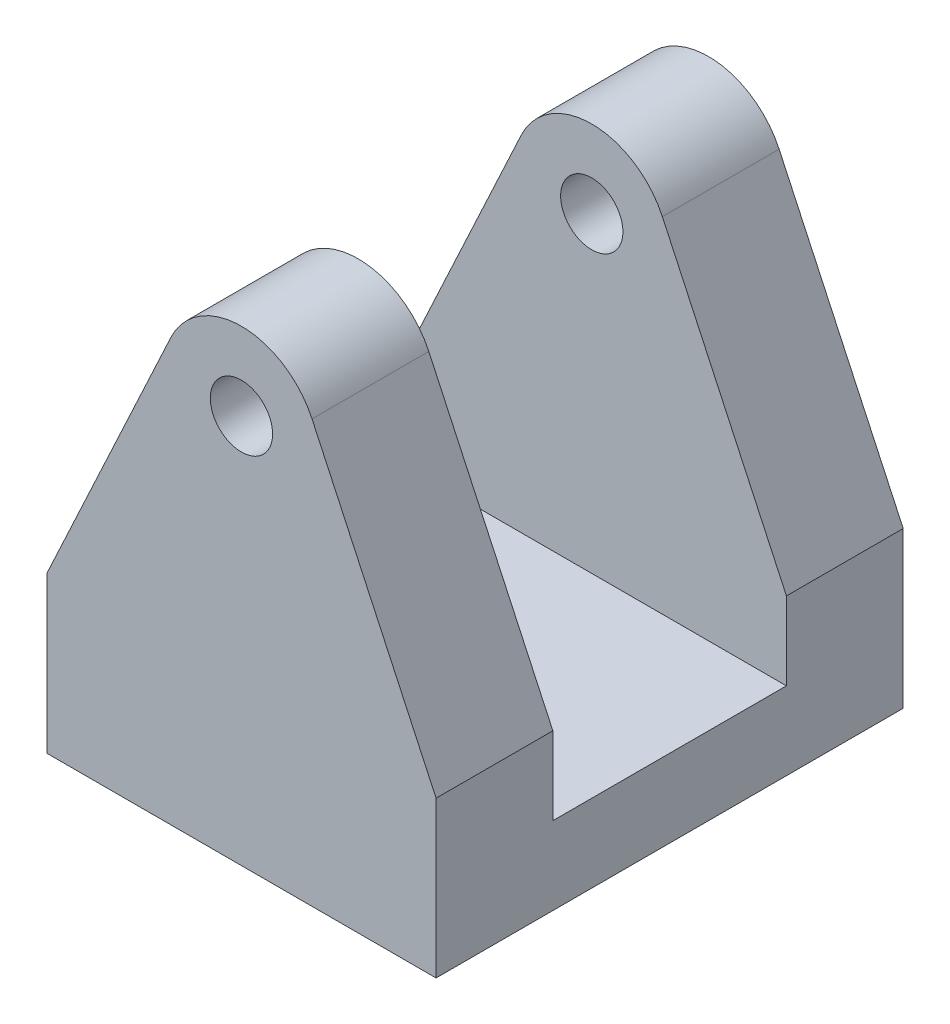
ISO-10303-21;
HEADER;
FILE_DESCRIPTION(('STEP AP214'),'2;1');
FILE_NAME('part.step','',(''),(''),'','','');
FILE_SCHEMA(('AUTOMOTIVE_DESIGN { 1 0 10303 214 1 1 1 1 }'));
ENDSEC;
DATA;
#1=APPLICATION_CONTEXT('core data for automotive mechanical design processes');
#2=APPLICATION_PROTOCOL_DEFINITION('international standard','automotive_design',2000,#1);
#3=PRODUCT_CONTEXT('',#1,'mechanical');
#4=PRODUCT('Part','Part','',(#3));
#5=PRODUCT_RELATED_PRODUCT_CATEGORY('part','',(#4));
#6=PRODUCT_DEFINITION_FORMATION('','',#4);
#7=PRODUCT_DEFINITION_CONTEXT('part definition',#1,'design');
#8=PRODUCT_DEFINITION('design','',#6,#7);
#9=PRODUCT_DEFINITION_SHAPE('','',#8);
#10=(LENGTH_UNIT() NAMED_UNIT(*) SI_UNIT(.MILLI.,.METRE.));
#11=(NAMED_UNIT(*) PLANE_ANGLE_UNIT() SI_UNIT($,.RADIAN.));
#12=(NAMED_UNIT(*) SI_UNIT($,.STERADIAN.) SOLID_ANGLE_UNIT());
#13=UNCERTAINTY_MEASURE_WITH_UNIT(LENGTH_MEASURE(1.E-05),#10,'distance_accuracy_value','');
#14=(GEOMETRIC_REPRESENTATION_CONTEXT(3) GLOBAL_UNCERTAINTY_ASSIGNED_CONTEXT((#13)) GLOBAL_UNIT_ASSIGNED_CONTEXT((#10,
#11,#12)) REPRESENTATION_CONTEXT('',''));
#15=CARTESIAN_POINT('',(0.,0.,0.));
#16=DIRECTION('',(0.,0.,1.));
#17=DIRECTION('',(1.,0.,0.));
#18=AXIS2_PLACEMENT_3D('',#15,#16,#17);
#19=CARTESIAN_POINT('',(34.2295020663656,53.4720968910606,0.));
#20=DIRECTION('',(0.,0.,1.));
#21=DIRECTION('',(1.,0.,0.));
#22=AXIS2_PLACEMENT_3D('',#19,#20,#21);
#23=PLANE('',#22);
#24=CARTESIAN_POINT('',(34.2295020663656,53.4720968910606,0.));
#25=DIRECTION('',(0.,0.,1.));
#26=DIRECTION('',(1.,0.,0.));
#27=AXIS2_PLACEMENT_3D('',#24,#25,#26);
#28=CIRCLE('',#27,5.08000000000001);
#29=CARTESIAN_POINT('',(39.3095020663656,53.4720968910606,0.));
#30=VERTEX_POINT('',#29);
#31=EDGE_CURVE('E123',#30,#30,#28,.F.);
#32=ORIENTED_EDGE('',*,*,#31,.F.);
#33=EDGE_LOOP('',(#32));
#34=FACE_BOUND('',#33,.T.);
#35=DIRECTION('',(1.,0.,0.));
#36=VECTOR('',#35,1.);
#37=CARTESIAN_POINT('',(65.9812170051089,2.66866701357397,0.));
#38=LINE('',#37,#36);
#39=CARTESIAN_POINT('',(2.47778712762231,2.66866701357397,0.));
#40=VERTEX_POINT('',#39);
#41=CARTESIAN_POINT('',(65.9812170051089,2.66866701357397,0.));
#42=VERTEX_POINT('',#41);
#43=EDGE_CURVE('E48',#40,#42,#38,.T.);
#44=ORIENTED_EDGE('',*,*,#43,.F.);
#45=DIRECTION('',(0.,-1.,0.));
#46=VECTOR('',#45,1.);
#47=CARTESIAN_POINT('',(2.47778712762231,-10.031332986426,0.));
#48=LINE('',#47,#46);
#49=CARTESIAN_POINT('',(2.47778712762231,15.3700389645686,0.));
#50=VERTEX_POINT('',#49);
#51=EDGE_CURVE('E127',#50,#40,#48,.T.);
#52=ORIENTED_EDGE('',*,*,#51,.F.);
#53=DIRECTION('',(-0.422117576661537,-0.906541091993844,0.));
#54=VECTOR('',#53,1.);
#55=CARTESIAN_POINT('',(2.47778712762231,15.3700389645686,0.));
#56=LINE('',#55,#54);
#57=CARTESIAN_POINT('',(22.7158083330674,58.8332796769767,0.));
#58=VERTEX_POINT('',#57);
#59=EDGE_CURVE('E79',#58,#50,#56,.T.);
#60=ORIENTED_EDGE('',*,*,#59,.F.);
#61=CARTESIAN_POINT('',(34.2295020663656,53.4720968910606,0.));
#62=DIRECTION('',(0.,0.,1.));
#63=DIRECTION('',(1.,0.,0.));
#64=AXIS2_PLACEMENT_3D('',#61,#62,#63);
#65=CIRCLE('',#64,12.7006859754973);
#66=CARTESIAN_POINT('',(45.7431957996639,58.8332796769767,0.));
#67=VERTEX_POINT('',#66);
#68=EDGE_CURVE('E110',#67,#58,#65,.T.);
#69=ORIENTED_EDGE('',*,*,#68,.F.);
#70=DIRECTION('',(-0.422117576661537,0.906541091993844,0.));
#71=VECTOR('',#70,1.);
#72=CARTESIAN_POINT('',(45.7431957996639,58.8332796769767,0.));
#73=LINE('',#72,#71);
#74=CARTESIAN_POINT('',(65.9812170051089,15.3700389645686,0.));
#75=VERTEX_POINT('',#74);
#76=EDGE_CURVE('E122',#75,#67,#73,.T.);
#77=ORIENTED_EDGE('',*,*,#76,.F.);
#78=DIRECTION('',(0.,1.,0.));
#79=VECTOR('',#78,1.);
#80=CARTESIAN_POINT('',(65.9812170051089,15.3700389645686,0.));
#81=LINE('',#80,#79);
#82=EDGE_CURVE('E120',#42,#75,#81,.T.);
#83=ORIENTED_EDGE('',*,*,#82,.F.);
#84=EDGE_LOOP('',(#44,#52,#60,#69,#77,#83));
#85=FACE_BOUND('',#84,.T.);
#86=ADVANCED_FACE('F33',(#34,#85),#23,.F.);
#87=CARTESIAN_POINT('',(65.9812170051089,-10.031332986426,19.05));
#88=DIRECTION('',(0.,1.,0.));
#89=DIRECTION('',(0.,0.,1.));
#90=AXIS2_PLACEMENT_3D('',#87,#88,#89);
#91=PLANE('',#90);
#92=DIRECTION('',(0.,0.,-1.));
#93=VECTOR('',#92,1.);
#94=CARTESIAN_POINT('',(2.47778712762231,-10.031332986426,19.05));
#95=LINE('',#94,#93);
#96=CARTESIAN_POINT('',(2.47778712762231,-10.031332986426,19.05));
#97=VERTEX_POINT('',#96);
#98=CARTESIAN_POINT('',(2.47778712762231,-10.031332986426,-57.15));
#99=VERTEX_POINT('',#98);
#100=EDGE_CURVE('E116',#97,#99,#95,.T.);
#101=ORIENTED_EDGE('',*,*,#100,.T.);
#102=DIRECTION('',(1.,0.,0.));
#103=VECTOR('',#102,1.);
#104=CARTESIAN_POINT('',(65.9812170051089,-10.031332986426,-57.15));
#105=LINE('',#104,#103);
#106=CARTESIAN_POINT('',(65.9812170051089,-10.031332986426,-57.15));
#107=VERTEX_POINT('',#106);
#108=EDGE_CURVE('E169',#99,#107,#105,.T.);
#109=ORIENTED_EDGE('',*,*,#108,.T.);
#110=DIRECTION('',(0.,0.,-1.));
#111=VECTOR('',#110,1.);
#112=CARTESIAN_POINT('',(65.9812170051089,-10.031332986426,19.05));
#113=LINE('',#112,#111);
#114=CARTESIAN_POINT('',(65.9812170051089,-10.031332986426,19.05));
#115=VERTEX_POINT('',#114);
#116=EDGE_CURVE('E11',#115,#107,#113,.T.);
#117=ORIENTED_EDGE('',*,*,#116,.F.);
#118=DIRECTION('',(1.,0.,0.));
#119=VECTOR('',#118,1.);
#120=CARTESIAN_POINT('',(65.9812170051089,-10.031332986426,19.05));
#121=LINE('',#120,#119);
#122=EDGE_CURVE('E129',#97,#115,#121,.T.);
#123=ORIENTED_EDGE('',*,*,#122,.F.);
#124=EDGE_LOOP('',(#101,#109,#117,#123));
#125=FACE_BOUND('',#124,.T.);
#126=ADVANCED_FACE('F35',(#125),#91,.F.);
#127=CARTESIAN_POINT('',(65.9812170051089,15.3700389645686,19.05));
#128=DIRECTION('',(-1.,0.,0.));
#129=DIRECTION('',(0.,0.,1.));
#130=AXIS2_PLACEMENT_3D('',#127,#128,#129);
#131=PLANE('',#130);
#132=ORIENTED_EDGE('',*,*,#116,.T.);
#133=DIRECTION('',(0.,1.,0.));
#134=VECTOR('',#133,1.);
#135=CARTESIAN_POINT('',(65.9812170051089,15.3700389645686,-57.15));
#136=LINE('',#135,#134);
#137=CARTESIAN_POINT('',(65.9812170051089,15.3700389645686,-57.15));
#138=VERTEX_POINT('',#137);
#139=EDGE_CURVE('E175',#107,#138,#136,.T.);
#140=ORIENTED_EDGE('',*,*,#139,.T.);
#141=DIRECTION('',(0.,0.,1.));
#142=VECTOR('',#141,1.);
#143=CARTESIAN_POINT('',(65.9812170051089,15.3700389645686,-57.15));
#144=LINE('',#143,#142);
#145=CARTESIAN_POINT('',(65.9812170051089,15.3700389645686,-38.1));
#146=VERTEX_POINT('',#145);
#147=EDGE_CURVE('E225',#138,#146,#144,.T.);
#148=ORIENTED_EDGE('',*,*,#147,.T.);
#149=DIRECTION('',(0.,1.,0.));
#150=VECTOR('',#149,1.);
#151=CARTESIAN_POINT('',(65.9812170051089,15.3700389645686,-38.1));
#152=LINE('',#151,#150);
#153=CARTESIAN_POINT('',(65.9812170051089,2.66866701357397,-38.1));
#154=VERTEX_POINT('',#153);
#155=EDGE_CURVE('E203',#154,#146,#152,.T.);
#156=ORIENTED_EDGE('',*,*,#155,.F.);
#157=DIRECTION('',(0.,0.,1.));
#158=VECTOR('',#157,1.);
#159=CARTESIAN_POINT('',(65.9812170051089,2.66866701357397,-19.05));
#160=LINE('',#159,#158);
#161=EDGE_CURVE('E153',#154,#42,#160,.T.);
#162=ORIENTED_EDGE('',*,*,#161,.T.);
#163=ORIENTED_EDGE('',*,*,#82,.T.);
#164=DIRECTION('',(0.,0.,-1.));
#165=VECTOR('',#164,1.);
#166=CARTESIAN_POINT('',(65.9812170051089,15.3700389645686,19.05));
#167=LINE('',#166,#165);
#168=CARTESIAN_POINT('',(65.9812170051089,15.3700389645686,19.05));
#169=VERTEX_POINT('',#168);
#170=EDGE_CURVE('E41',#169,#75,#167,.T.);
#171=ORIENTED_EDGE('',*,*,#170,.F.);
#172=DIRECTION('',(0.,1.,0.));
#173=VECTOR('',#172,1.);
#174=CARTESIAN_POINT('',(65.9812170051089,15.3700389645686,19.05));
#175=LINE('',#174,#173);
#176=EDGE_CURVE('E87',#115,#169,#175,.T.);
#177=ORIENTED_EDGE('',*,*,#176,.F.);
#178=EDGE_LOOP('',(#132,#140,#148,#156,#162,#163,#171,#177));
#179=FACE_BOUND('',#178,.T.);
#180=ADVANCED_FACE('F172',(#179),#131,.F.);
#181=CARTESIAN_POINT('',(45.7431957996639,58.8332796769767,19.05));
#182=DIRECTION('',(-0.906541091993844,-0.422117576661537,0.));
#183=DIRECTION('',(0.422117576661537,-0.906541091993844,0.));
#184=AXIS2_PLACEMENT_3D('',#181,#182,#183);
#185=PLANE('',#184);
#186=ORIENTED_EDGE('',*,*,#76,.T.);
#187=DIRECTION('',(0.,0.,-1.));
#188=VECTOR('',#187,1.);
#189=CARTESIAN_POINT('',(45.7431957996639,58.8332796769767,19.05));
#190=LINE('',#189,#188);
#191=CARTESIAN_POINT('',(45.7431957996639,58.8332796769767,19.05));
#192=VERTEX_POINT('',#191);
#193=EDGE_CURVE('E111',#192,#67,#190,.T.);
#194=ORIENTED_EDGE('',*,*,#193,.F.);
#195=DIRECTION('',(-0.422117576661537,0.906541091993844,0.));
#196=VECTOR('',#195,1.);
#197=CARTESIAN_POINT('',(45.7431957996639,58.8332796769767,19.05));
#198=LINE('',#197,#196);
#199=EDGE_CURVE('E102',#169,#192,#198,.T.);
#200=ORIENTED_EDGE('',*,*,#199,.F.);
#201=ORIENTED_EDGE('',*,*,#170,.T.);
#202=EDGE_LOOP('',(#186,#194,#200,#201));
#203=FACE_BOUND('',#202,.T.);
#204=ADVANCED_FACE('F136',(#203),#185,.F.);
#205=CARTESIAN_POINT('',(34.2295020663656,53.4720968910606,19.05));
#206=DIRECTION('',(0.,0.,-1.));
#207=DIRECTION('',(-1.,0.,0.));
#208=AXIS2_PLACEMENT_3D('',#205,#206,#207);
#209=CYLINDRICAL_SURFACE('',#208,12.7006859754973);
#210=ORIENTED_EDGE('',*,*,#68,.T.);
#211=DIRECTION('',(0.,0.,-1.));
#212=VECTOR('',#211,1.);
#213=CARTESIAN_POINT('',(22.7158083330674,58.8332796769767,19.05));
#214=LINE('',#213,#212);
#215=CARTESIAN_POINT('',(22.7158083330674,58.8332796769767,19.05));
#216=VERTEX_POINT('',#215);
#217=EDGE_CURVE('E107',#216,#58,#214,.T.);
#218=ORIENTED_EDGE('',*,*,#217,.F.);
#219=CARTESIAN_POINT('',(34.2295020663656,53.4720968910606,19.05));
#220=DIRECTION('',(0.,0.,1.));
#221=DIRECTION('',(1.,0.,0.));
#222=AXIS2_PLACEMENT_3D('',#219,#220,#221);
#223=CIRCLE('',#222,12.7006859754973);
#224=EDGE_CURVE('E96',#192,#216,#223,.T.);
#225=ORIENTED_EDGE('',*,*,#224,.F.);
#226=ORIENTED_EDGE('',*,*,#193,.T.);
#227=EDGE_LOOP('',(#210,#218,#225,#226));
#228=FACE_BOUND('',#227,.T.);
#229=ADVANCED_FACE('F108',(#228),#209,.T.);
#230=CARTESIAN_POINT('',(2.47778712762231,15.3700389645686,19.05));
#231=DIRECTION('',(0.906541091993844,-0.422117576661537,0.));
#232=DIRECTION('',(0.422117576661537,0.906541091993844,0.));
#233=AXIS2_PLACEMENT_3D('',#230,#231,#232);
#234=PLANE('',#233);
#235=ORIENTED_EDGE('',*,*,#59,.T.);
#236=DIRECTION('',(0.,0.,-1.));
#237=VECTOR('',#236,1.);
#238=CARTESIAN_POINT('',(2.47778712762231,15.3700389645686,19.05));
#239=LINE('',#238,#237);
#240=CARTESIAN_POINT('',(2.47778712762231,15.3700389645686,19.05));
#241=VERTEX_POINT('',#240);
#242=EDGE_CURVE('E112',#241,#50,#239,.T.);
#243=ORIENTED_EDGE('',*,*,#242,.F.);
#244=DIRECTION('',(-0.422117576661537,-0.906541091993844,0.));
#245=VECTOR('',#244,1.);
#246=CARTESIAN_POINT('',(2.47778712762231,15.3700389645686,19.05));
#247=LINE('',#246,#245);
#248=EDGE_CURVE('E100',#216,#241,#247,.T.);
#249=ORIENTED_EDGE('',*,*,#248,.F.);
#250=ORIENTED_EDGE('',*,*,#217,.T.);
#251=EDGE_LOOP('',(#235,#243,#249,#250));
#252=FACE_BOUND('',#251,.T.);
#253=ADVANCED_FACE('F114',(#252),#234,.F.);
#254=CARTESIAN_POINT('',(2.47778712762231,-10.031332986426,19.05));
#255=DIRECTION('',(1.,0.,0.));
#256=DIRECTION('',(0.,0.,-1.));
#257=AXIS2_PLACEMENT_3D('',#254,#255,#256);
#258=PLANE('',#257);
#259=ORIENTED_EDGE('',*,*,#51,.T.);
#260=DIRECTION('',(0.,0.,1.));
#261=VECTOR('',#260,1.);
#262=CARTESIAN_POINT('',(2.47778712762231,2.66866701357397,-19.05));
#263=LINE('',#262,#261);
#264=CARTESIAN_POINT('',(2.47778712762231,2.66866701357397,-38.1));
#265=VERTEX_POINT('',#264);
#266=EDGE_CURVE('E143',#265,#40,#263,.T.);
#267=ORIENTED_EDGE('',*,*,#266,.F.);
#268=DIRECTION('',(0.,-1.,0.));
#269=VECTOR('',#268,1.);
#270=CARTESIAN_POINT('',(2.47778712762231,-10.031332986426,-38.1));
#271=LINE('',#270,#269);
#272=CARTESIAN_POINT('',(2.47778712762231,15.3700389645686,-38.1));
#273=VERTEX_POINT('',#272);
#274=EDGE_CURVE('E190',#273,#265,#271,.T.);
#275=ORIENTED_EDGE('',*,*,#274,.F.);
#276=DIRECTION('',(0.,0.,1.));
#277=VECTOR('',#276,1.);
#278=CARTESIAN_POINT('',(2.47778712762231,15.3700389645686,-57.15));
#279=LINE('',#278,#277);
#280=CARTESIAN_POINT('',(2.47778712762231,15.3700389645686,-57.15));
#281=VERTEX_POINT('',#280);
#282=EDGE_CURVE('E202',#281,#273,#279,.T.);
#283=ORIENTED_EDGE('',*,*,#282,.F.);
#284=DIRECTION('',(0.,-1.,0.));
#285=VECTOR('',#284,1.);
#286=CARTESIAN_POINT('',(2.47778712762231,-10.031332986426,-57.15));
#287=LINE('',#286,#285);
#288=EDGE_CURVE('E199',#281,#99,#287,.T.);
#289=ORIENTED_EDGE('',*,*,#288,.T.);
#290=ORIENTED_EDGE('',*,*,#100,.F.);
#291=DIRECTION('',(0.,-1.,0.));
#292=VECTOR('',#291,1.);
#293=CARTESIAN_POINT('',(2.47778712762231,-10.031332986426,19.05));
#294=LINE('',#293,#292);
#295=EDGE_CURVE('E57',#241,#97,#294,.T.);
#296=ORIENTED_EDGE('',*,*,#295,.F.);
#297=ORIENTED_EDGE('',*,*,#242,.T.);
#298=EDGE_LOOP('',(#259,#267,#275,#283,#289,#290,#296,#297));
#299=FACE_BOUND('',#298,.T.);
#300=ADVANCED_FACE('F140',(#299),#258,.F.);
#301=CARTESIAN_POINT('',(34.2295020663656,53.4720968910606,19.05));
#302=DIRECTION('',(0.,0.,1.));
#303=DIRECTION('',(1.,0.,0.));
#304=AXIS2_PLACEMENT_3D('',#301,#302,#303);
#305=PLANE('',#304);
#306=CARTESIAN_POINT('',(34.2295020663656,53.4720968910606,19.05));
#307=DIRECTION('',(0.,0.,1.));
#308=DIRECTION('',(1.,0.,0.));
#309=AXIS2_PLACEMENT_3D('',#306,#307,#308);
#310=CIRCLE('',#309,5.08000000000001);
#311=CARTESIAN_POINT('',(39.3095020663656,53.4720968910606,19.05));
#312=VERTEX_POINT('',#311);
#313=EDGE_CURVE('E152',#312,#312,#310,.T.);
#314=ORIENTED_EDGE('',*,*,#313,.F.);
#315=EDGE_LOOP('',(#314));
#316=FACE_BOUND('',#315,.T.);
#317=ORIENTED_EDGE('',*,*,#122,.T.);
#318=ORIENTED_EDGE('',*,*,#176,.T.);
#319=ORIENTED_EDGE('',*,*,#199,.T.);
#320=ORIENTED_EDGE('',*,*,#224,.T.);
#321=ORIENTED_EDGE('',*,*,#248,.T.);
#322=ORIENTED_EDGE('',*,*,#295,.T.);
#323=EDGE_LOOP('',(#317,#318,#319,#320,#321,#322));
#324=FACE_BOUND('',#323,.T.);
#325=ADVANCED_FACE('F98',(#316,#324),#305,.T.);
#326=CARTESIAN_POINT('',(34.2295020663656,53.4720968910606,-14.3684097937107));
#327=DIRECTION('',(0.,0.,1.));
#328=DIRECTION('',(1.,0.,0.));
#329=AXIS2_PLACEMENT_3D('',#326,#327,#328);
#330=CYLINDRICAL_SURFACE('',#329,5.08000000000001);
#331=ORIENTED_EDGE('',*,*,#31,.T.);
#332=EDGE_LOOP('',(#331));
#333=FACE_BOUND('',#332,.T.);
#334=ORIENTED_EDGE('',*,*,#313,.T.);
#335=EDGE_LOOP('',(#334));
#336=FACE_BOUND('',#335,.T.);
#337=ADVANCED_FACE('F308',(#333,#336),#330,.F.);
#338=CARTESIAN_POINT('',(65.9812170051089,2.66866701357397,-19.05));
#339=DIRECTION('',(0.,-1.,0.));
#340=DIRECTION('',(0.,0.,-1.));
#341=AXIS2_PLACEMENT_3D('',#338,#339,#340);
#342=PLANE('',#341);
#343=ORIENTED_EDGE('',*,*,#43,.T.);
#344=ORIENTED_EDGE('',*,*,#161,.F.);
#345=DIRECTION('',(1.,0.,0.));
#346=VECTOR('',#345,1.);
#347=CARTESIAN_POINT('',(65.9812170051089,2.66866701357397,-38.1));
#348=LINE('',#347,#346);
#349=EDGE_CURVE('E151',#265,#154,#348,.T.);
#350=ORIENTED_EDGE('',*,*,#349,.F.);
#351=ORIENTED_EDGE('',*,*,#266,.T.);
#352=EDGE_LOOP('',(#343,#344,#350,#351));
#353=FACE_BOUND('',#352,.T.);
#354=ADVANCED_FACE('F147',(#353),#342,.F.);
#355=CARTESIAN_POINT('',(34.2295020663656,53.4720968910606,-38.1));
#356=DIRECTION('',(0.,0.,-1.));
#357=DIRECTION('',(1.,0.,0.));
#358=AXIS2_PLACEMENT_3D('',#355,#356,#357);
#359=PLANE('',#358);
#360=CARTESIAN_POINT('',(34.2295020663656,53.4720968910606,-38.1));
#361=DIRECTION('',(0.,0.,1.));
#362=DIRECTION('',(1.,0.,0.));
#363=AXIS2_PLACEMENT_3D('',#360,#361,#362);
#364=CIRCLE('',#363,5.08000000000001);
#365=CARTESIAN_POINT('',(39.3095020663656,53.4720968910606,-38.1));
#366=VERTEX_POINT('',#365);
#367=EDGE_CURVE('E207',#366,#366,#364,.F.);
#368=ORIENTED_EDGE('',*,*,#367,.T.);
#369=EDGE_LOOP('',(#368));
#370=FACE_BOUND('',#369,.T.);
#371=ORIENTED_EDGE('',*,*,#349,.T.);
#372=ORIENTED_EDGE('',*,*,#155,.T.);
#373=DIRECTION('',(-0.422117576661537,0.906541091993844,0.));
#374=VECTOR('',#373,1.);
#375=CARTESIAN_POINT('',(45.7431957996639,58.8332796769767,-38.1));
#376=LINE('',#375,#374);
#377=CARTESIAN_POINT('',(45.7431957996639,58.8332796769767,-38.1));
#378=VERTEX_POINT('',#377);
#379=EDGE_CURVE('E206',#146,#378,#376,.T.);
#380=ORIENTED_EDGE('',*,*,#379,.T.);
#381=CARTESIAN_POINT('',(34.2295020663656,53.4720968910606,-38.1));
#382=DIRECTION('',(0.,0.,1.));
#383=DIRECTION('',(1.,0.,0.));
#384=AXIS2_PLACEMENT_3D('',#381,#382,#383);
#385=CIRCLE('',#384,12.7006859754973);
#386=CARTESIAN_POINT('',(22.7158083330674,58.8332796769767,-38.1));
#387=VERTEX_POINT('',#386);
#388=EDGE_CURVE('E210',#378,#387,#385,.T.);
#389=ORIENTED_EDGE('',*,*,#388,.T.);
#390=DIRECTION('',(-0.422117576661537,-0.906541091993844,0.));
#391=VECTOR('',#390,1.);
#392=CARTESIAN_POINT('',(2.47778712762231,15.3700389645686,-38.1));
#393=LINE('',#392,#391);
#394=EDGE_CURVE('E213',#387,#273,#393,.T.);
#395=ORIENTED_EDGE('',*,*,#394,.T.);
#396=ORIENTED_EDGE('',*,*,#274,.T.);
#397=EDGE_LOOP('',(#371,#372,#380,#389,#395,#396));
#398=FACE_BOUND('',#397,.T.);
#399=ADVANCED_FACE('F237',(#370,#398),#359,.F.);
#400=CARTESIAN_POINT('',(45.7431957996639,58.8332796769767,-57.15));
#401=DIRECTION('',(-0.906541091993844,-0.422117576661537,0.));
#402=DIRECTION('',(0.422117576661537,-0.906541091993844,0.));
#403=AXIS2_PLACEMENT_3D('',#400,#401,#402);
#404=PLANE('',#403);
#405=ORIENTED_EDGE('',*,*,#379,.F.);
#406=ORIENTED_EDGE('',*,*,#147,.F.);
#407=DIRECTION('',(-0.422117576661537,0.906541091993844,0.));
#408=VECTOR('',#407,1.);
#409=CARTESIAN_POINT('',(45.7431957996639,58.8332796769767,-57.15));
#410=LINE('',#409,#408);
#411=CARTESIAN_POINT('',(45.7431957996639,58.8332796769767,-57.15));
#412=VERTEX_POINT('',#411);
#413=EDGE_CURVE('E185',#138,#412,#410,.T.);
#414=ORIENTED_EDGE('',*,*,#413,.T.);
#415=DIRECTION('',(0.,0.,1.));
#416=VECTOR('',#415,1.);
#417=CARTESIAN_POINT('',(45.7431957996639,58.8332796769767,-57.15));
#418=LINE('',#417,#416);
#419=EDGE_CURVE('E222',#412,#378,#418,.T.);
#420=ORIENTED_EDGE('',*,*,#419,.T.);
#421=EDGE_LOOP('',(#405,#406,#414,#420));
#422=FACE_BOUND('',#421,.T.);
#423=ADVANCED_FACE('F233',(#422),#404,.F.);
#424=CARTESIAN_POINT('',(34.2295020663656,53.4720968910606,-57.15));
#425=DIRECTION('',(0.,0.,1.));
#426=DIRECTION('',(-1.,0.,0.));
#427=AXIS2_PLACEMENT_3D('',#424,#425,#426);
#428=CYLINDRICAL_SURFACE('',#427,12.7006859754973);
#429=ORIENTED_EDGE('',*,*,#388,.F.);
#430=ORIENTED_EDGE('',*,*,#419,.F.);
#431=CARTESIAN_POINT('',(34.2295020663656,53.4720968910606,-57.15));
#432=DIRECTION('',(0.,0.,1.));
#433=DIRECTION('',(1.,0.,0.));
#434=AXIS2_PLACEMENT_3D('',#431,#432,#433);
#435=CIRCLE('',#434,12.7006859754973);
#436=CARTESIAN_POINT('',(22.7158083330674,58.8332796769767,-57.15));
#437=VERTEX_POINT('',#436);
#438=EDGE_CURVE('E188',#412,#437,#435,.T.);
#439=ORIENTED_EDGE('',*,*,#438,.T.);
#440=DIRECTION('',(0.,0.,1.));
#441=VECTOR('',#440,1.);
#442=CARTESIAN_POINT('',(22.7158083330674,58.8332796769767,-57.15));
#443=LINE('',#442,#441);
#444=EDGE_CURVE('E219',#437,#387,#443,.T.);
#445=ORIENTED_EDGE('',*,*,#444,.T.);
#446=EDGE_LOOP('',(#429,#430,#439,#445));
#447=FACE_BOUND('',#446,.T.);
#448=ADVANCED_FACE('F259',(#447),#428,.T.);
#449=CARTESIAN_POINT('',(2.47778712762231,15.3700389645686,-57.15));
#450=DIRECTION('',(0.906541091993844,-0.422117576661537,0.));
#451=DIRECTION('',(0.422117576661537,0.906541091993844,0.));
#452=AXIS2_PLACEMENT_3D('',#449,#450,#451);
#453=PLANE('',#452);
#454=ORIENTED_EDGE('',*,*,#394,.F.);
#455=ORIENTED_EDGE('',*,*,#444,.F.);
#456=DIRECTION('',(-0.422117576661537,-0.906541091993844,0.));
#457=VECTOR('',#456,1.);
#458=CARTESIAN_POINT('',(2.47778712762231,15.3700389645686,-57.15));
#459=LINE('',#458,#457);
#460=EDGE_CURVE('E196',#437,#281,#459,.T.);
#461=ORIENTED_EDGE('',*,*,#460,.T.);
#462=ORIENTED_EDGE('',*,*,#282,.T.);
#463=EDGE_LOOP('',(#454,#455,#461,#462));
#464=FACE_BOUND('',#463,.T.);
#465=ADVANCED_FACE('F254',(#464),#453,.F.);
#466=CARTESIAN_POINT('',(34.2295020663656,53.4720968910606,-57.15));
#467=DIRECTION('',(0.,0.,-1.));
#468=DIRECTION('',(1.,0.,0.));
#469=AXIS2_PLACEMENT_3D('',#466,#467,#468);
#470=PLANE('',#469);
#471=CARTESIAN_POINT('',(34.2295020663656,53.4720968910606,-57.15));
#472=DIRECTION('',(0.,0.,1.));
#473=DIRECTION('',(1.,0.,0.));
#474=AXIS2_PLACEMENT_3D('',#471,#472,#473);
#475=CIRCLE('',#474,5.08000000000001);
#476=CARTESIAN_POINT('',(39.3095020663656,53.4720968910606,-57.15));
#477=VERTEX_POINT('',#476);
#478=EDGE_CURVE('E239',#477,#477,#475,.T.);
#479=ORIENTED_EDGE('',*,*,#478,.T.);
#480=EDGE_LOOP('',(#479));
#481=FACE_BOUND('',#480,.T.);
#482=ORIENTED_EDGE('',*,*,#108,.F.);
#483=ORIENTED_EDGE('',*,*,#288,.F.);
#484=ORIENTED_EDGE('',*,*,#460,.F.);
#485=ORIENTED_EDGE('',*,*,#438,.F.);
#486=ORIENTED_EDGE('',*,*,#413,.F.);
#487=ORIENTED_EDGE('',*,*,#139,.F.);
#488=EDGE_LOOP('',(#482,#483,#484,#485,#486,#487));
#489=FACE_BOUND('',#488,.T.);
#490=ADVANCED_FACE('F180',(#481,#489),#470,.T.);
#491=CARTESIAN_POINT('',(34.2295020663656,53.4720968910606,-23.7315902062893));
#492=DIRECTION('',(0.,0.,-1.));
#493=DIRECTION('',(1.,0.,0.));
#494=AXIS2_PLACEMENT_3D('',#491,#492,#493);
#495=CYLINDRICAL_SURFACE('',#494,5.08000000000001);
#496=ORIENTED_EDGE('',*,*,#367,.F.);
#497=EDGE_LOOP('',(#496));
#498=FACE_BOUND('',#497,.T.);
#499=ORIENTED_EDGE('',*,*,#478,.F.);
#500=EDGE_LOOP('',(#499));
#501=FACE_BOUND('',#500,.T.);
#502=ADVANCED_FACE('F247',(#498,#501),#495,.F.);
#503=CLOSED_SHELL('',(#86,#126,#180,#204,#229,#253,#300,#325,#337,#354,#399,#423,#448,#465,#490,#502));
#504=MANIFOLD_SOLID_BREP('B2',#503);
#505=ADVANCED_BREP_SHAPE_REPRESENTATION('',(#18,#504),#14);
#506=SHAPE_DEFINITION_REPRESENTATION(#9,#505);
ENDSEC;
END-ISO-10303-21;
